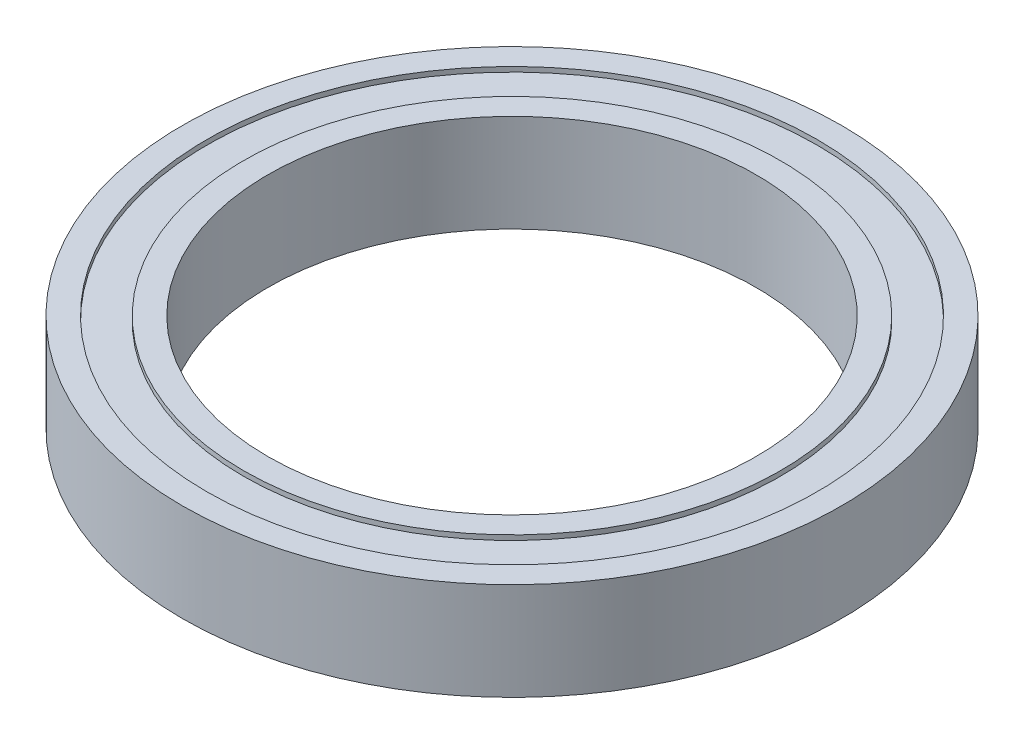
ISO-10303-21;
HEADER;
FILE_DESCRIPTION(('STEP AP214'),'2;1');
FILE_NAME('part.step','',(''),(''),'','','');
FILE_SCHEMA(('AUTOMOTIVE_DESIGN { 1 0 10303 214 1 1 1 1 }'));
ENDSEC;
DATA;
#1=APPLICATION_CONTEXT('core data for automotive mechanical design processes');
#2=APPLICATION_PROTOCOL_DEFINITION('international standard','automotive_design',2000,#1);
#3=PRODUCT_CONTEXT('',#1,'mechanical');
#4=PRODUCT('Part','Part','',(#3));
#5=PRODUCT_RELATED_PRODUCT_CATEGORY('part','',(#4));
#6=PRODUCT_DEFINITION_FORMATION('','',#4);
#7=PRODUCT_DEFINITION_CONTEXT('part definition',#1,'design');
#8=PRODUCT_DEFINITION('design','',#6,#7);
#9=PRODUCT_DEFINITION_SHAPE('','',#8);
#10=(LENGTH_UNIT() NAMED_UNIT(*) SI_UNIT(.MILLI.,.METRE.));
#11=(NAMED_UNIT(*) PLANE_ANGLE_UNIT() SI_UNIT($,.RADIAN.));
#12=(NAMED_UNIT(*) SI_UNIT($,.STERADIAN.) SOLID_ANGLE_UNIT());
#13=UNCERTAINTY_MEASURE_WITH_UNIT(LENGTH_MEASURE(1.E-05),#10,'distance_accuracy_value','');
#14=(GEOMETRIC_REPRESENTATION_CONTEXT(3) GLOBAL_UNCERTAINTY_ASSIGNED_CONTEXT((#13)) GLOBAL_UNIT_ASSIGNED_CONTEXT((#10,
#11,#12)) REPRESENTATION_CONTEXT('',''));
#15=CARTESIAN_POINT('',(0.,0.,0.));
#16=DIRECTION('',(0.,0.,1.));
#17=DIRECTION('',(1.,0.,0.));
#18=AXIS2_PLACEMENT_3D('',#15,#16,#17);
#19=CARTESIAN_POINT('',(0.,2.,0.));
#20=DIRECTION('',(0.,1.,0.));
#21=DIRECTION('',(0.,0.,1.));
#22=AXIS2_PLACEMENT_3D('',#19,#20,#21);
#23=PLANE('',#22);
#24=CARTESIAN_POINT('',(0.,2.,0.));
#25=DIRECTION('',(0.,1.,0.));
#26=DIRECTION('',(0.,0.,1.));
#27=AXIS2_PLACEMENT_3D('',#24,#25,#26);
#28=CIRCLE('',#27,10.);
#29=CARTESIAN_POINT('',(0.,2.,10.));
#30=VERTEX_POINT('',#29);
#31=EDGE_CURVE('E52',#30,#30,#28,.T.);
#32=ORIENTED_EDGE('',*,*,#31,.F.);
#33=EDGE_LOOP('',(#32));
#34=FACE_BOUND('',#33,.T.);
#35=CARTESIAN_POINT('',(0.,2.,0.));
#36=DIRECTION('',(0.,1.,0.));
#37=DIRECTION('',(0.,0.,1.));
#38=AXIS2_PLACEMENT_3D('',#35,#36,#37);
#39=CIRCLE('',#38,11.);
#40=CARTESIAN_POINT('',(0.,2.,11.));
#41=VERTEX_POINT('',#40);
#42=EDGE_CURVE('E86',#41,#41,#39,.T.);
#43=ORIENTED_EDGE('',*,*,#42,.T.);
#44=EDGE_LOOP('',(#43));
#45=FACE_BOUND('',#44,.T.);
#46=ADVANCED_FACE('F39',(#34,#45),#23,.T.);
#47=CARTESIAN_POINT('',(0.,-2.,0.));
#48=DIRECTION('',(0.,1.,0.));
#49=DIRECTION('',(0.,0.,1.));
#50=AXIS2_PLACEMENT_3D('',#47,#48,#49);
#51=PLANE('',#50);
#52=CARTESIAN_POINT('',(0.,-2.,0.));
#53=DIRECTION('',(0.,1.,0.));
#54=DIRECTION('',(0.,0.,1.));
#55=AXIS2_PLACEMENT_3D('',#52,#53,#54);
#56=CIRCLE('',#55,10.);
#57=CARTESIAN_POINT('',(0.,-2.,10.));
#58=VERTEX_POINT('',#57);
#59=EDGE_CURVE('E54',#58,#58,#56,.T.);
#60=ORIENTED_EDGE('',*,*,#59,.T.);
#61=EDGE_LOOP('',(#60));
#62=FACE_BOUND('',#61,.T.);
#63=CARTESIAN_POINT('',(0.,-2.,0.));
#64=DIRECTION('',(0.,1.,0.));
#65=DIRECTION('',(0.,0.,1.));
#66=AXIS2_PLACEMENT_3D('',#63,#64,#65);
#67=CIRCLE('',#66,11.);
#68=CARTESIAN_POINT('',(0.,-2.,11.));
#69=VERTEX_POINT('',#68);
#70=EDGE_CURVE('E70',#69,#69,#67,.T.);
#71=ORIENTED_EDGE('',*,*,#70,.F.);
#72=EDGE_LOOP('',(#71));
#73=FACE_BOUND('',#72,.T.);
#74=ADVANCED_FACE('F113',(#62,#73),#51,.F.);
#75=CARTESIAN_POINT('',(0.,2.,0.));
#76=DIRECTION('',(0.,1.,0.));
#77=DIRECTION('',(0.,0.,1.));
#78=AXIS2_PLACEMENT_3D('',#75,#76,#77);
#79=CIRCLE('',#78,12.5);
#80=CARTESIAN_POINT('',(0.,2.,12.5));
#81=VERTEX_POINT('',#80);
#82=EDGE_CURVE('E78',#81,#81,#79,.T.);
#83=ORIENTED_EDGE('',*,*,#82,.F.);
#84=EDGE_LOOP('',(#83));
#85=FACE_BOUND('',#84,.T.);
#86=CARTESIAN_POINT('',(0.,2.,0.));
#87=DIRECTION('',(0.,1.,0.));
#88=DIRECTION('',(0.,0.,1.));
#89=AXIS2_PLACEMENT_3D('',#86,#87,#88);
#90=CIRCLE('',#89,13.5);
#91=CARTESIAN_POINT('',(0.,2.,13.5));
#92=VERTEX_POINT('',#91);
#93=EDGE_CURVE('E10',#92,#92,#90,.T.);
#94=ORIENTED_EDGE('',*,*,#93,.T.);
#95=EDGE_LOOP('',(#94));
#96=FACE_BOUND('',#95,.T.);
#97=ADVANCED_FACE('F110',(#85,#96),#23,.T.);
#98=CARTESIAN_POINT('',(0.,-2.,0.));
#99=DIRECTION('',(0.,1.,0.));
#100=DIRECTION('',(0.,0.,1.));
#101=AXIS2_PLACEMENT_3D('',#98,#99,#100);
#102=CIRCLE('',#101,12.5);
#103=CARTESIAN_POINT('',(0.,-2.,12.5));
#104=VERTEX_POINT('',#103);
#105=EDGE_CURVE('E62',#104,#104,#102,.T.);
#106=ORIENTED_EDGE('',*,*,#105,.T.);
#107=EDGE_LOOP('',(#106));
#108=FACE_BOUND('',#107,.T.);
#109=CARTESIAN_POINT('',(0.,-2.,0.));
#110=DIRECTION('',(0.,1.,0.));
#111=DIRECTION('',(0.,0.,1.));
#112=AXIS2_PLACEMENT_3D('',#109,#110,#111);
#113=CIRCLE('',#112,13.5);
#114=CARTESIAN_POINT('',(0.,-2.,13.5));
#115=VERTEX_POINT('',#114);
#116=EDGE_CURVE('E43',#115,#115,#113,.T.);
#117=ORIENTED_EDGE('',*,*,#116,.F.);
#118=EDGE_LOOP('',(#117));
#119=FACE_BOUND('',#118,.T.);
#120=ADVANCED_FACE('F112',(#108,#119),#51,.F.);
#121=CARTESIAN_POINT('',(0.,2.,0.));
#122=DIRECTION('',(0.,-1.,0.));
#123=DIRECTION('',(0.,0.,-1.));
#124=AXIS2_PLACEMENT_3D('',#121,#122,#123);
#125=CYLINDRICAL_SURFACE('',#124,13.5);
#126=ORIENTED_EDGE('',*,*,#93,.F.);
#127=EDGE_LOOP('',(#126));
#128=FACE_BOUND('',#127,.T.);
#129=ORIENTED_EDGE('',*,*,#116,.T.);
#130=EDGE_LOOP('',(#129));
#131=FACE_BOUND('',#130,.T.);
#132=ADVANCED_FACE('F41',(#128,#131),#125,.T.);
#133=CARTESIAN_POINT('',(0.,2.,0.));
#134=DIRECTION('',(0.,-1.,0.));
#135=DIRECTION('',(0.,0.,-1.));
#136=AXIS2_PLACEMENT_3D('',#133,#134,#135);
#137=CYLINDRICAL_SURFACE('',#136,10.);
#138=ORIENTED_EDGE('',*,*,#31,.T.);
#139=EDGE_LOOP('',(#138));
#140=FACE_BOUND('',#139,.T.);
#141=ORIENTED_EDGE('',*,*,#59,.F.);
#142=EDGE_LOOP('',(#141));
#143=FACE_BOUND('',#142,.T.);
#144=ADVANCED_FACE('F141',(#140,#143),#137,.F.);
#145=CARTESIAN_POINT('',(0.,-1.8,0.));
#146=DIRECTION('',(0.,1.,0.));
#147=DIRECTION('',(0.,0.,1.));
#148=AXIS2_PLACEMENT_3D('',#145,#146,#147);
#149=PLANE('',#148);
#150=CARTESIAN_POINT('',(0.,-1.8,0.));
#151=DIRECTION('',(0.,1.,0.));
#152=DIRECTION('',(0.,0.,1.));
#153=AXIS2_PLACEMENT_3D('',#150,#151,#152);
#154=CIRCLE('',#153,12.5);
#155=CARTESIAN_POINT('',(0.,-1.8,12.5));
#156=VERTEX_POINT('',#155);
#157=EDGE_CURVE('E58',#156,#156,#154,.T.);
#158=ORIENTED_EDGE('',*,*,#157,.F.);
#159=EDGE_LOOP('',(#158));
#160=FACE_BOUND('',#159,.T.);
#161=CARTESIAN_POINT('',(0.,-1.8,0.));
#162=DIRECTION('',(0.,1.,0.));
#163=DIRECTION('',(0.,0.,1.));
#164=AXIS2_PLACEMENT_3D('',#161,#162,#163);
#165=CIRCLE('',#164,11.);
#166=CARTESIAN_POINT('',(0.,-1.8,11.));
#167=VERTEX_POINT('',#166);
#168=EDGE_CURVE('E66',#167,#167,#165,.T.);
#169=ORIENTED_EDGE('',*,*,#168,.T.);
#170=EDGE_LOOP('',(#169));
#171=FACE_BOUND('',#170,.T.);
#172=ADVANCED_FACE('F138',(#160,#171),#149,.F.);
#173=CARTESIAN_POINT('',(0.,-1.8,0.));
#174=DIRECTION('',(0.,-1.,0.));
#175=DIRECTION('',(0.,0.,-1.));
#176=AXIS2_PLACEMENT_3D('',#173,#174,#175);
#177=CYLINDRICAL_SURFACE('',#176,12.5);
#178=ORIENTED_EDGE('',*,*,#157,.T.);
#179=EDGE_LOOP('',(#178));
#180=FACE_BOUND('',#179,.T.);
#181=ORIENTED_EDGE('',*,*,#105,.F.);
#182=EDGE_LOOP('',(#181));
#183=FACE_BOUND('',#182,.T.);
#184=ADVANCED_FACE('F136',(#180,#183),#177,.F.);
#185=CARTESIAN_POINT('',(0.,-1.8,0.));
#186=DIRECTION('',(0.,-1.,0.));
#187=DIRECTION('',(0.,0.,-1.));
#188=AXIS2_PLACEMENT_3D('',#185,#186,#187);
#189=CYLINDRICAL_SURFACE('',#188,11.);
#190=ORIENTED_EDGE('',*,*,#168,.F.);
#191=EDGE_LOOP('',(#190));
#192=FACE_BOUND('',#191,.T.);
#193=ORIENTED_EDGE('',*,*,#70,.T.);
#194=EDGE_LOOP('',(#193));
#195=FACE_BOUND('',#194,.T.);
#196=ADVANCED_FACE('F106',(#192,#195),#189,.T.);
#197=CARTESIAN_POINT('',(0.,1.8,0.));
#198=DIRECTION('',(0.,1.,0.));
#199=DIRECTION('',(0.,0.,1.));
#200=AXIS2_PLACEMENT_3D('',#197,#198,#199);
#201=CYLINDRICAL_SURFACE('',#200,12.5);
#202=CARTESIAN_POINT('',(0.,1.8,0.));
#203=DIRECTION('',(0.,1.,0.));
#204=DIRECTION('',(0.,0.,1.));
#205=AXIS2_PLACEMENT_3D('',#202,#203,#204);
#206=CIRCLE('',#205,12.5);
#207=CARTESIAN_POINT('',(0.,1.8,12.5));
#208=VERTEX_POINT('',#207);
#209=EDGE_CURVE('E74',#208,#208,#206,.T.);
#210=ORIENTED_EDGE('',*,*,#209,.F.);
#211=EDGE_LOOP('',(#210));
#212=FACE_BOUND('',#211,.T.);
#213=ORIENTED_EDGE('',*,*,#82,.T.);
#214=EDGE_LOOP('',(#213));
#215=FACE_BOUND('',#214,.T.);
#216=ADVANCED_FACE('F100',(#212,#215),#201,.F.);
#217=CARTESIAN_POINT('',(0.,1.8,0.));
#218=DIRECTION('',(0.,1.,0.));
#219=DIRECTION('',(0.,0.,1.));
#220=AXIS2_PLACEMENT_3D('',#217,#218,#219);
#221=PLANE('',#220);
#222=CARTESIAN_POINT('',(0.,1.8,0.));
#223=DIRECTION('',(0.,1.,0.));
#224=DIRECTION('',(0.,0.,1.));
#225=AXIS2_PLACEMENT_3D('',#222,#223,#224);
#226=CIRCLE('',#225,11.);
#227=CARTESIAN_POINT('',(0.,1.8,11.));
#228=VERTEX_POINT('',#227);
#229=EDGE_CURVE('E82',#228,#228,#226,.T.);
#230=ORIENTED_EDGE('',*,*,#229,.F.);
#231=EDGE_LOOP('',(#230));
#232=FACE_BOUND('',#231,.T.);
#233=ORIENTED_EDGE('',*,*,#209,.T.);
#234=EDGE_LOOP('',(#233));
#235=FACE_BOUND('',#234,.T.);
#236=ADVANCED_FACE('F97',(#232,#235),#221,.T.);
#237=CARTESIAN_POINT('',(0.,1.8,0.));
#238=DIRECTION('',(0.,1.,0.));
#239=DIRECTION('',(0.,0.,1.));
#240=AXIS2_PLACEMENT_3D('',#237,#238,#239);
#241=CYLINDRICAL_SURFACE('',#240,11.);
#242=ORIENTED_EDGE('',*,*,#229,.T.);
#243=EDGE_LOOP('',(#242));
#244=FACE_BOUND('',#243,.T.);
#245=ORIENTED_EDGE('',*,*,#42,.F.);
#246=EDGE_LOOP('',(#245));
#247=FACE_BOUND('',#246,.T.);
#248=ADVANCED_FACE('F94',(#244,#247),#241,.T.);
#249=CLOSED_SHELL('',(#46,#74,#97,#120,#132,#144,#172,#184,#196,#216,#236,#248));
#250=MANIFOLD_SOLID_BREP('B2',#249);
#251=ADVANCED_BREP_SHAPE_REPRESENTATION('',(#18,#250),#14);
#252=SHAPE_DEFINITION_REPRESENTATION(#9,#251);
ENDSEC;
END-ISO-10303-21;
